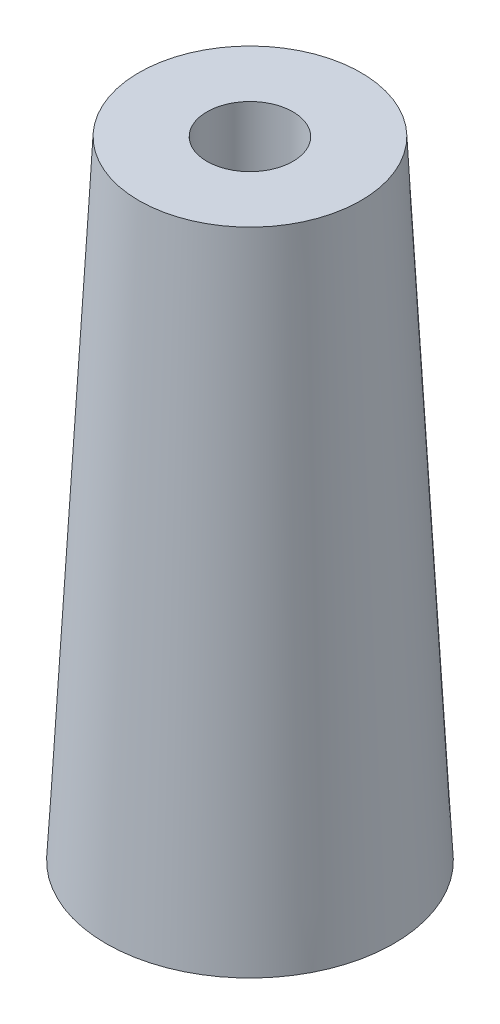
ISO-10303-21;
HEADER;
FILE_DESCRIPTION(('STEP AP214'),'2;1');
FILE_NAME('part.step','',(''),(''),'','','');
FILE_SCHEMA(('AUTOMOTIVE_DESIGN { 1 0 10303 214 1 1 1 1 }'));
ENDSEC;
DATA;
#1=APPLICATION_CONTEXT('core data for automotive mechanical design processes');
#2=APPLICATION_PROTOCOL_DEFINITION('international standard','automotive_design',2000,#1);
#3=PRODUCT_CONTEXT('',#1,'mechanical');
#4=PRODUCT('Part','Part','',(#3));
#5=PRODUCT_RELATED_PRODUCT_CATEGORY('part','',(#4));
#6=PRODUCT_DEFINITION_FORMATION('','',#4);
#7=PRODUCT_DEFINITION_CONTEXT('part definition',#1,'design');
#8=PRODUCT_DEFINITION('design','',#6,#7);
#9=PRODUCT_DEFINITION_SHAPE('','',#8);
#10=(LENGTH_UNIT() NAMED_UNIT(*) SI_UNIT(.MILLI.,.METRE.));
#11=(NAMED_UNIT(*) PLANE_ANGLE_UNIT() SI_UNIT($,.RADIAN.));
#12=(NAMED_UNIT(*) SI_UNIT($,.STERADIAN.) SOLID_ANGLE_UNIT());
#13=UNCERTAINTY_MEASURE_WITH_UNIT(LENGTH_MEASURE(1.E-05),#10,'distance_accuracy_value','');
#14=(GEOMETRIC_REPRESENTATION_CONTEXT(3) GLOBAL_UNCERTAINTY_ASSIGNED_CONTEXT((#13)) GLOBAL_UNIT_ASSIGNED_CONTEXT((#10,
#11,#12)) REPRESENTATION_CONTEXT('',''));
#15=CARTESIAN_POINT('',(0.,0.,0.));
#16=DIRECTION('',(0.,0.,1.));
#17=DIRECTION('',(1.,0.,0.));
#18=AXIS2_PLACEMENT_3D('',#15,#16,#17);
#19=CARTESIAN_POINT('',(0.,0.,0.));
#20=DIRECTION('',(0.,-1.,0.));
#21=DIRECTION('',(0.,0.,1.));
#22=AXIS2_PLACEMENT_3D('',#19,#20,#21);
#23=CONICAL_SURFACE('',#22,6.35,0.05235987755983);
#24=CARTESIAN_POINT('',(0.,27.686,0.));
#25=DIRECTION('',(0.,1.,0.));
#26=DIRECTION('',(0.,0.,1.));
#27=AXIS2_PLACEMENT_3D('',#24,#25,#26);
#28=CIRCLE('',#27,4.89903822276972);
#29=CARTESIAN_POINT('',(0.,27.686,4.89903822276972));
#30=VERTEX_POINT('',#29);
#31=EDGE_CURVE('E11',#30,#30,#28,.T.);
#32=ORIENTED_EDGE('',*,*,#31,.F.);
#33=EDGE_LOOP('',(#32));
#34=FACE_BOUND('',#33,.T.);
#35=CARTESIAN_POINT('',(0.,0.,0.));
#36=DIRECTION('',(0.,1.,0.));
#37=DIRECTION('',(0.,0.,1.));
#38=AXIS2_PLACEMENT_3D('',#35,#36,#37);
#39=CIRCLE('',#38,6.35);
#40=CARTESIAN_POINT('',(0.,0.,6.35));
#41=VERTEX_POINT('',#40);
#42=EDGE_CURVE('E50',#41,#41,#39,.T.);
#43=ORIENTED_EDGE('',*,*,#42,.T.);
#44=EDGE_LOOP('',(#43));
#45=FACE_BOUND('',#44,.T.);
#46=ADVANCED_FACE('F43',(#34,#45),#23,.T.);
#47=CARTESIAN_POINT('',(0.,27.686,0.));
#48=DIRECTION('',(0.,1.,0.));
#49=DIRECTION('',(0.,0.,1.));
#50=AXIS2_PLACEMENT_3D('',#47,#48,#49);
#51=PLANE('',#50);
#52=CARTESIAN_POINT('',(0.,27.686,0.));
#53=DIRECTION('',(0.,1.,0.));
#54=DIRECTION('',(0.,0.,1.));
#55=AXIS2_PLACEMENT_3D('',#52,#53,#54);
#56=CIRCLE('',#55,1.89864999999999);
#57=CARTESIAN_POINT('',(0.,27.686,1.89864999999999));
#58=VERTEX_POINT('',#57);
#59=EDGE_CURVE('E64',#58,#58,#56,.T.);
#60=ORIENTED_EDGE('',*,*,#59,.F.);
#61=EDGE_LOOP('',(#60));
#62=FACE_BOUND('',#61,.T.);
#63=ORIENTED_EDGE('',*,*,#31,.T.);
#64=EDGE_LOOP('',(#63));
#65=FACE_BOUND('',#64,.T.);
#66=ADVANCED_FACE('F74',(#62,#65),#51,.T.);
#67=CARTESIAN_POINT('',(0.,0.,0.));
#68=DIRECTION('',(0.,1.,0.));
#69=DIRECTION('',(0.,0.,1.));
#70=AXIS2_PLACEMENT_3D('',#67,#68,#69);
#71=PLANE('',#70);
#72=ORIENTED_EDGE('',*,*,#42,.F.);
#73=EDGE_LOOP('',(#72));
#74=FACE_BOUND('',#73,.T.);
#75=ADVANCED_FACE('F57',(#74),#71,.F.);
#76=CARTESIAN_POINT('',(0.,14.986,0.));
#77=DIRECTION('',(0.,1.,0.));
#78=DIRECTION('',(0.,0.,1.));
#79=AXIS2_PLACEMENT_3D('',#76,#77,#78);
#80=CONICAL_SURFACE('',#79,1.89865,1.02974425867665);
#81=CARTESIAN_POINT('',(0.,13.8451759856833,0.));
#82=VERTEX_POINT('',#81);
#83=VERTEX_LOOP('',#82);
#84=FACE_BOUND('',#83,.T.);
#85=CARTESIAN_POINT('',(0.,14.986,0.));
#86=DIRECTION('',(0.,1.,0.));
#87=DIRECTION('',(0.,0.,1.));
#88=AXIS2_PLACEMENT_3D('',#85,#86,#87);
#89=CIRCLE('',#88,1.89865);
#90=CARTESIAN_POINT('',(0.,14.986,1.89865));
#91=VERTEX_POINT('',#90);
#92=EDGE_CURVE('E61',#91,#91,#89,.T.);
#93=ORIENTED_EDGE('',*,*,#92,.T.);
#94=EDGE_LOOP('',(#93));
#95=FACE_BOUND('',#94,.T.);
#96=ADVANCED_FACE('F53',(#84,#95),#80,.F.);
#97=CARTESIAN_POINT('',(0.,27.686,0.));
#98=DIRECTION('',(0.,1.,0.));
#99=DIRECTION('',(0.,0.,1.));
#100=AXIS2_PLACEMENT_3D('',#97,#98,#99);
#101=CYLINDRICAL_SURFACE('',#100,1.89864999999999);
#102=ORIENTED_EDGE('',*,*,#92,.F.);
#103=EDGE_LOOP('',(#102));
#104=FACE_BOUND('',#103,.T.);
#105=ORIENTED_EDGE('',*,*,#59,.T.);
#106=EDGE_LOOP('',(#105));
#107=FACE_BOUND('',#106,.T.);
#108=ADVANCED_FACE('F56',(#104,#107),#101,.F.);
#109=CLOSED_SHELL('',(#46,#66,#75,#96,#108));
#110=MANIFOLD_SOLID_BREP('B2',#109);
#111=ADVANCED_BREP_SHAPE_REPRESENTATION('',(#18,#110),#14);
#112=SHAPE_DEFINITION_REPRESENTATION(#9,#111);
ENDSEC;
END-ISO-10303-21;
